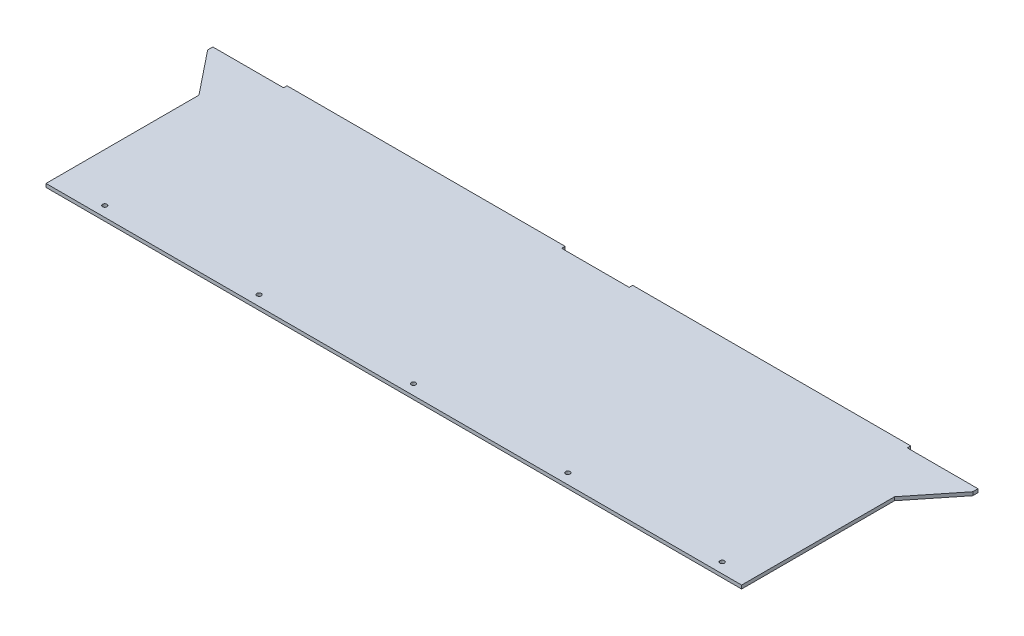
ISO-10303-21;
HEADER;
FILE_DESCRIPTION(('STEP AP214'),'2;1');
FILE_NAME('part.step','',(''),(''),'','','');
FILE_SCHEMA(('AUTOMOTIVE_DESIGN { 1 0 10303 214 1 1 1 1 }'));
ENDSEC;
DATA;
#1=APPLICATION_CONTEXT('core data for automotive mechanical design processes');
#2=APPLICATION_PROTOCOL_DEFINITION('international standard','automotive_design',2000,#1);
#3=PRODUCT_CONTEXT('',#1,'mechanical');
#4=PRODUCT('Part','Part','',(#3));
#5=PRODUCT_RELATED_PRODUCT_CATEGORY('part','',(#4));
#6=PRODUCT_DEFINITION_FORMATION('','',#4);
#7=PRODUCT_DEFINITION_CONTEXT('part definition',#1,'design');
#8=PRODUCT_DEFINITION('design','',#6,#7);
#9=PRODUCT_DEFINITION_SHAPE('','',#8);
#10=(LENGTH_UNIT() NAMED_UNIT(*) SI_UNIT(.MILLI.,.METRE.));
#11=(NAMED_UNIT(*) PLANE_ANGLE_UNIT() SI_UNIT($,.RADIAN.));
#12=(NAMED_UNIT(*) SI_UNIT($,.STERADIAN.) SOLID_ANGLE_UNIT());
#13=UNCERTAINTY_MEASURE_WITH_UNIT(LENGTH_MEASURE(1.E-05),#10,'distance_accuracy_value','');
#14=(GEOMETRIC_REPRESENTATION_CONTEXT(3) GLOBAL_UNCERTAINTY_ASSIGNED_CONTEXT((#13)) GLOBAL_UNIT_ASSIGNED_CONTEXT((#10,
#11,#12)) REPRESENTATION_CONTEXT('',''));
#15=CARTESIAN_POINT('',(0.,0.,0.));
#16=DIRECTION('',(0.,0.,1.));
#17=DIRECTION('',(1.,0.,0.));
#18=AXIS2_PLACEMENT_3D('',#15,#16,#17);
#19=CARTESIAN_POINT('',(-273.3802,-8.4125,82.677));
#20=DIRECTION('',(0.,1.,0.));
#21=DIRECTION('',(0.,0.,1.));
#22=AXIS2_PLACEMENT_3D('',#19,#20,#21);
#23=CYLINDRICAL_SURFACE('',#22,2.02500000000001);
#24=CARTESIAN_POINT('',(-273.3802,1.5875,82.677));
#25=DIRECTION('',(0.,1.,0.));
#26=DIRECTION('',(0.,0.,1.));
#27=AXIS2_PLACEMENT_3D('',#24,#25,#26);
#28=CIRCLE('',#27,2.02500000000001);
#29=CARTESIAN_POINT('',(-273.3802,1.5875,84.702));
#30=VERTEX_POINT('',#29);
#31=EDGE_CURVE('E43',#30,#30,#28,.T.);
#32=ORIENTED_EDGE('',*,*,#31,.T.);
#33=EDGE_LOOP('',(#32));
#34=FACE_BOUND('',#33,.T.);
#35=CARTESIAN_POINT('',(-273.3802,-1.5875,82.677));
#36=DIRECTION('',(0.,1.,0.));
#37=DIRECTION('',(0.,0.,1.));
#38=AXIS2_PLACEMENT_3D('',#35,#36,#37);
#39=CIRCLE('',#38,2.02500000000001);
#40=CARTESIAN_POINT('',(-273.3802,-1.5875,84.702));
#41=VERTEX_POINT('',#40);
#42=EDGE_CURVE('E11',#41,#41,#39,.T.);
#43=ORIENTED_EDGE('',*,*,#42,.F.);
#44=EDGE_LOOP('',(#43));
#45=FACE_BOUND('',#44,.T.);
#46=ADVANCED_FACE('F36',(#34,#45),#23,.F.);
#47=CARTESIAN_POINT('',(-132.4102,-8.4125,82.677));
#48=DIRECTION('',(0.,1.,0.));
#49=DIRECTION('',(0.,0.,1.));
#50=AXIS2_PLACEMENT_3D('',#47,#48,#49);
#51=CYLINDRICAL_SURFACE('',#50,2.02500000000001);
#52=CARTESIAN_POINT('',(-132.4102,1.5875,82.677));
#53=DIRECTION('',(0.,1.,0.));
#54=DIRECTION('',(0.,0.,1.));
#55=AXIS2_PLACEMENT_3D('',#52,#53,#54);
#56=CIRCLE('',#55,2.02500000000001);
#57=CARTESIAN_POINT('',(-132.4102,1.5875,84.702));
#58=VERTEX_POINT('',#57);
#59=EDGE_CURVE('E207',#58,#58,#56,.T.);
#60=ORIENTED_EDGE('',*,*,#59,.T.);
#61=EDGE_LOOP('',(#60));
#62=FACE_BOUND('',#61,.T.);
#63=CARTESIAN_POINT('',(-132.4102,-1.5875,82.677));
#64=DIRECTION('',(0.,1.,0.));
#65=DIRECTION('',(0.,0.,1.));
#66=AXIS2_PLACEMENT_3D('',#63,#64,#65);
#67=CIRCLE('',#66,2.02500000000001);
#68=CARTESIAN_POINT('',(-132.4102,-1.5875,84.702));
#69=VERTEX_POINT('',#68);
#70=EDGE_CURVE('E210',#69,#69,#67,.T.);
#71=ORIENTED_EDGE('',*,*,#70,.F.);
#72=EDGE_LOOP('',(#71));
#73=FACE_BOUND('',#72,.T.);
#74=ADVANCED_FACE('F235',(#62,#73),#51,.F.);
#75=CARTESIAN_POINT('',(8.55980000000006,-8.4125,82.677));
#76=DIRECTION('',(0.,1.,0.));
#77=DIRECTION('',(0.,0.,1.));
#78=AXIS2_PLACEMENT_3D('',#75,#76,#77);
#79=CYLINDRICAL_SURFACE('',#78,2.02500000000001);
#80=CARTESIAN_POINT('',(8.55980000000006,1.5875,82.677));
#81=DIRECTION('',(0.,1.,0.));
#82=DIRECTION('',(0.,0.,1.));
#83=AXIS2_PLACEMENT_3D('',#80,#81,#82);
#84=CIRCLE('',#83,2.02500000000001);
#85=CARTESIAN_POINT('',(8.55980000000006,1.5875,84.702));
#86=VERTEX_POINT('',#85);
#87=EDGE_CURVE('E197',#86,#86,#84,.T.);
#88=ORIENTED_EDGE('',*,*,#87,.T.);
#89=EDGE_LOOP('',(#88));
#90=FACE_BOUND('',#89,.T.);
#91=CARTESIAN_POINT('',(8.55980000000006,-1.5875,82.677));
#92=DIRECTION('',(0.,1.,0.));
#93=DIRECTION('',(0.,0.,1.));
#94=AXIS2_PLACEMENT_3D('',#91,#92,#93);
#95=CIRCLE('',#94,2.02500000000001);
#96=CARTESIAN_POINT('',(8.55980000000006,-1.5875,84.702));
#97=VERTEX_POINT('',#96);
#98=EDGE_CURVE('E204',#97,#97,#95,.T.);
#99=ORIENTED_EDGE('',*,*,#98,.F.);
#100=EDGE_LOOP('',(#99));
#101=FACE_BOUND('',#100,.T.);
#102=ADVANCED_FACE('F239',(#90,#101),#79,.F.);
#103=CARTESIAN_POINT('',(317.6778,1.5875,-92.075));
#104=DIRECTION('',(-1.,0.,0.));
#105=DIRECTION('',(0.,0.,1.));
#106=AXIS2_PLACEMENT_3D('',#103,#104,#105);
#107=PLANE('',#106);
#108=DIRECTION('',(0.,-1.,0.));
#109=VECTOR('',#108,1.);
#110=CARTESIAN_POINT('',(317.6778,1.5875,-47.625));
#111=LINE('',#110,#109);
#112=CARTESIAN_POINT('',(317.6778,1.5875,-47.625));
#113=VERTEX_POINT('',#112);
#114=CARTESIAN_POINT('',(317.6778,-1.5875,-47.625));
#115=VERTEX_POINT('',#114);
#116=EDGE_CURVE('E58',#113,#115,#111,.T.);
#117=ORIENTED_EDGE('',*,*,#116,.F.);
#118=DIRECTION('',(0.,0.,-1.));
#119=VECTOR('',#118,1.);
#120=CARTESIAN_POINT('',(317.6778,1.5875,-92.075));
#121=LINE('',#120,#119);
#122=CARTESIAN_POINT('',(317.6778,1.5875,92.075));
#123=VERTEX_POINT('',#122);
#124=EDGE_CURVE('E193',#123,#113,#121,.T.);
#125=ORIENTED_EDGE('',*,*,#124,.F.);
#126=DIRECTION('',(0.,-1.,0.));
#127=VECTOR('',#126,1.);
#128=CARTESIAN_POINT('',(317.6778,1.5875,92.075));
#129=LINE('',#128,#127);
#130=CARTESIAN_POINT('',(317.6778,-1.5875,92.075));
#131=VERTEX_POINT('',#130);
#132=EDGE_CURVE('E174',#123,#131,#129,.T.);
#133=ORIENTED_EDGE('',*,*,#132,.T.);
#134=DIRECTION('',(0.,0.,-1.));
#135=VECTOR('',#134,1.);
#136=CARTESIAN_POINT('',(317.6778,-1.5875,-92.075));
#137=LINE('',#136,#135);
#138=EDGE_CURVE('E182',#131,#115,#137,.T.);
#139=ORIENTED_EDGE('',*,*,#138,.T.);
#140=EDGE_LOOP('',(#117,#125,#133,#139));
#141=FACE_BOUND('',#140,.T.);
#142=ADVANCED_FACE('F244',(#141),#107,.F.);
#143=CARTESIAN_POINT('',(-317.6778,1.5875,-92.075));
#144=DIRECTION('',(0.,0.,1.));
#145=DIRECTION('',(1.,0.,0.));
#146=AXIS2_PLACEMENT_3D('',#143,#144,#145);
#147=PLANE('',#146);
#148=DIRECTION('',(0.,-1.,0.));
#149=VECTOR('',#148,1.);
#150=CARTESIAN_POINT('',(284.822900000001,-1.58750000000007,-92.075));
#151=LINE('',#150,#149);
#152=CARTESIAN_POINT('',(284.822900000002,1.5875,-92.075));
#153=VERTEX_POINT('',#152);
#154=CARTESIAN_POINT('',(284.822900000002,-1.5875,-92.075));
#155=VERTEX_POINT('',#154);
#156=EDGE_CURVE('E333',#153,#155,#151,.T.);
#157=ORIENTED_EDGE('',*,*,#156,.F.);
#158=DIRECTION('',(-1.,0.,0.));
#159=VECTOR('',#158,1.);
#160=CARTESIAN_POINT('',(-317.6778,1.5875,-92.075));
#161=LINE('',#160,#159);
#162=CARTESIAN_POINT('',(349.4278,1.5875,-92.075));
#163=VERTEX_POINT('',#162);
#164=EDGE_CURVE('E172',#163,#153,#161,.T.);
#165=ORIENTED_EDGE('',*,*,#164,.F.);
#166=DIRECTION('',(0.,-1.,0.));
#167=VECTOR('',#166,1.);
#168=CARTESIAN_POINT('',(349.4278,1.5875,-92.075));
#169=LINE('',#168,#167);
#170=CARTESIAN_POINT('',(349.4278,-1.5875,-92.075));
#171=VERTEX_POINT('',#170);
#172=EDGE_CURVE('E343',#163,#171,#169,.T.);
#173=ORIENTED_EDGE('',*,*,#172,.T.);
#174=DIRECTION('',(-1.,0.,0.));
#175=VECTOR('',#174,1.);
#176=CARTESIAN_POINT('',(-317.6778,-1.5875,-92.075));
#177=LINE('',#176,#175);
#178=EDGE_CURVE('E186',#171,#155,#177,.T.);
#179=ORIENTED_EDGE('',*,*,#178,.T.);
#180=EDGE_LOOP('',(#157,#165,#173,#179));
#181=FACE_BOUND('',#180,.T.);
#182=ADVANCED_FACE('F251',(#181),#147,.F.);
#183=DIRECTION('',(0.,1.,0.));
#184=VECTOR('',#183,1.);
#185=CARTESIAN_POINT('',(30.8229000000015,1.58749999999994,-92.075));
#186=LINE('',#185,#184);
#187=CARTESIAN_POINT('',(30.8229000000015,-1.58750000000007,-92.075));
#188=VERTEX_POINT('',#187);
#189=CARTESIAN_POINT('',(30.8229000000014,1.5875,-92.075));
#190=VERTEX_POINT('',#189);
#191=EDGE_CURVE('E330',#188,#190,#186,.T.);
#192=ORIENTED_EDGE('',*,*,#191,.F.);
#193=CARTESIAN_POINT('',(-30.8229000000015,-1.5875,-92.075));
#194=VERTEX_POINT('',#193);
#195=EDGE_CURVE('E189',#188,#194,#177,.T.);
#196=ORIENTED_EDGE('',*,*,#195,.T.);
#197=DIRECTION('',(0.,-1.,0.));
#198=VECTOR('',#197,1.);
#199=CARTESIAN_POINT('',(-30.8229000000015,-1.58750000000007,-92.075));
#200=LINE('',#199,#198);
#201=CARTESIAN_POINT('',(-30.8229000000015,1.5875,-92.075));
#202=VERTEX_POINT('',#201);
#203=EDGE_CURVE('E276',#202,#194,#200,.T.);
#204=ORIENTED_EDGE('',*,*,#203,.F.);
#205=EDGE_CURVE('E177',#190,#202,#161,.T.);
#206=ORIENTED_EDGE('',*,*,#205,.F.);
#207=EDGE_LOOP('',(#192,#196,#204,#206));
#208=FACE_BOUND('',#207,.T.);
#209=ADVANCED_FACE('F254',(#208),#147,.F.);
#210=DIRECTION('',(0.,1.,0.));
#211=VECTOR('',#210,1.);
#212=CARTESIAN_POINT('',(-284.822900000001,1.58749999999994,-92.075));
#213=LINE('',#212,#211);
#214=CARTESIAN_POINT('',(-284.822900000001,-1.5875,-92.075));
#215=VERTEX_POINT('',#214);
#216=CARTESIAN_POINT('',(-284.822900000001,1.58749999999994,-92.075));
#217=VERTEX_POINT('',#216);
#218=EDGE_CURVE('E267',#215,#217,#213,.T.);
#219=ORIENTED_EDGE('',*,*,#218,.F.);
#220=CARTESIAN_POINT('',(-349.4278,-1.5875,-92.075));
#221=VERTEX_POINT('',#220);
#222=EDGE_CURVE('E184',#215,#221,#177,.T.);
#223=ORIENTED_EDGE('',*,*,#222,.T.);
#224=DIRECTION('',(0.,-1.,0.));
#225=VECTOR('',#224,1.);
#226=CARTESIAN_POINT('',(-349.4278,1.5875,-92.075));
#227=LINE('',#226,#225);
#228=CARTESIAN_POINT('',(-349.4278,1.5875,-92.075));
#229=VERTEX_POINT('',#228);
#230=EDGE_CURVE('E357',#229,#221,#227,.T.);
#231=ORIENTED_EDGE('',*,*,#230,.F.);
#232=EDGE_CURVE('E179',#217,#229,#161,.T.);
#233=ORIENTED_EDGE('',*,*,#232,.F.);
#234=EDGE_LOOP('',(#219,#223,#231,#233));
#235=FACE_BOUND('',#234,.T.);
#236=ADVANCED_FACE('F256',(#235),#147,.F.);
#237=CARTESIAN_POINT('',(-317.6778,1.5875,-92.075));
#238=DIRECTION('',(1.,0.,0.));
#239=DIRECTION('',(0.,0.,-1.));
#240=AXIS2_PLACEMENT_3D('',#237,#238,#239);
#241=PLANE('',#240);
#242=DIRECTION('',(0.,0.,1.));
#243=VECTOR('',#242,1.);
#244=CARTESIAN_POINT('',(-317.6778,1.5875,-92.075));
#245=LINE('',#244,#243);
#246=CARTESIAN_POINT('',(-317.6778,1.5875,-47.625));
#247=VERTEX_POINT('',#246);
#248=CARTESIAN_POINT('',(-317.6778,1.5875,92.075));
#249=VERTEX_POINT('',#248);
#250=EDGE_CURVE('E154',#247,#249,#245,.T.);
#251=ORIENTED_EDGE('',*,*,#250,.F.);
#252=DIRECTION('',(0.,-1.,0.));
#253=VECTOR('',#252,1.);
#254=CARTESIAN_POINT('',(-317.6778,1.5875,-47.625));
#255=LINE('',#254,#253);
#256=CARTESIAN_POINT('',(-317.6778,-1.5875,-47.625));
#257=VERTEX_POINT('',#256);
#258=EDGE_CURVE('E161',#247,#257,#255,.T.);
#259=ORIENTED_EDGE('',*,*,#258,.T.);
#260=DIRECTION('',(0.,0.,1.));
#261=VECTOR('',#260,1.);
#262=CARTESIAN_POINT('',(-317.6778,-1.5875,-92.075));
#263=LINE('',#262,#261);
#264=CARTESIAN_POINT('',(-317.6778,-1.5875,92.075));
#265=VERTEX_POINT('',#264);
#266=EDGE_CURVE('E188',#257,#265,#263,.T.);
#267=ORIENTED_EDGE('',*,*,#266,.T.);
#268=DIRECTION('',(0.,-1.,0.));
#269=VECTOR('',#268,1.);
#270=CARTESIAN_POINT('',(-317.6778,1.5875,92.075));
#271=LINE('',#270,#269);
#272=EDGE_CURVE('E169',#249,#265,#271,.T.);
#273=ORIENTED_EDGE('',*,*,#272,.F.);
#274=EDGE_LOOP('',(#251,#259,#267,#273));
#275=FACE_BOUND('',#274,.T.);
#276=ADVANCED_FACE('F167',(#275),#241,.F.);
#277=CARTESIAN_POINT('',(-317.6778,1.5875,92.075));
#278=DIRECTION('',(0.,0.,-1.));
#279=DIRECTION('',(-1.,0.,0.));
#280=AXIS2_PLACEMENT_3D('',#277,#278,#279);
#281=PLANE('',#280);
#282=DIRECTION('',(1.,0.,0.));
#283=VECTOR('',#282,1.);
#284=CARTESIAN_POINT('',(-317.6778,-1.5875,92.075));
#285=LINE('',#284,#283);
#286=EDGE_CURVE('E191',#265,#131,#285,.T.);
#287=ORIENTED_EDGE('',*,*,#286,.T.);
#288=ORIENTED_EDGE('',*,*,#132,.F.);
#289=DIRECTION('',(1.,0.,0.));
#290=VECTOR('',#289,1.);
#291=CARTESIAN_POINT('',(-317.6778,1.5875,92.075));
#292=LINE('',#291,#290);
#293=EDGE_CURVE('E171',#249,#123,#292,.T.);
#294=ORIENTED_EDGE('',*,*,#293,.F.);
#295=ORIENTED_EDGE('',*,*,#272,.T.);
#296=EDGE_LOOP('',(#287,#288,#294,#295));
#297=FACE_BOUND('',#296,.T.);
#298=ADVANCED_FACE('F219',(#297),#281,.F.);
#299=CARTESIAN_POINT('',(0.,1.5875,0.));
#300=DIRECTION('',(0.,1.,0.));
#301=DIRECTION('',(0.,0.,1.));
#302=AXIS2_PLACEMENT_3D('',#299,#300,#301);
#303=PLANE('',#302);
#304=CARTESIAN_POINT('',(149.5298,1.5875,82.677));
#305=DIRECTION('',(0.,1.,0.));
#306=DIRECTION('',(0.,0.,1.));
#307=AXIS2_PLACEMENT_3D('',#304,#305,#306);
#308=CIRCLE('',#307,2.02500000000001);
#309=CARTESIAN_POINT('',(149.5298,1.5875,84.702));
#310=VERTEX_POINT('',#309);
#311=EDGE_CURVE('E371',#310,#310,#308,.T.);
#312=ORIENTED_EDGE('',*,*,#311,.F.);
#313=EDGE_LOOP('',(#312));
#314=FACE_BOUND('',#313,.T.);
#315=CARTESIAN_POINT('',(290.4998,1.5875,82.677));
#316=DIRECTION('',(0.,1.,0.));
#317=DIRECTION('',(0.,0.,1.));
#318=AXIS2_PLACEMENT_3D('',#315,#316,#317);
#319=CIRCLE('',#318,2.02500000000001);
#320=CARTESIAN_POINT('',(290.4998,1.5875,84.702));
#321=VERTEX_POINT('',#320);
#322=EDGE_CURVE('E201',#321,#321,#319,.T.);
#323=ORIENTED_EDGE('',*,*,#322,.F.);
#324=EDGE_LOOP('',(#323));
#325=FACE_BOUND('',#324,.T.);
#326=ORIENTED_EDGE('',*,*,#124,.T.);
#327=DIRECTION('',(-0.624695047554456,0.,0.780868809443005));
#328=VECTOR('',#327,1.);
#329=CARTESIAN_POINT('',(349.427800000003,1.5875,-87.3125));
#330=LINE('',#329,#328);
#331=CARTESIAN_POINT('',(349.427800000003,1.5875,-87.3125));
#332=VERTEX_POINT('',#331);
#333=EDGE_CURVE('E347',#332,#113,#330,.T.);
#334=ORIENTED_EDGE('',*,*,#333,.F.);
#335=DIRECTION('',(5.47826584329473E-13,0.,1.));
#336=VECTOR('',#335,1.);
#337=CARTESIAN_POINT('',(349.4278,1.5875,-92.075));
#338=LINE('',#337,#336);
#339=EDGE_CURVE('E353',#163,#332,#338,.T.);
#340=ORIENTED_EDGE('',*,*,#339,.F.);
#341=ORIENTED_EDGE('',*,*,#164,.T.);
#342=DIRECTION('',(0.,0.,1.));
#343=VECTOR('',#342,1.);
#344=CARTESIAN_POINT('',(284.822900000001,1.58749999999994,-95.25));
#345=LINE('',#344,#343);
#346=CARTESIAN_POINT('',(284.822900000001,1.58749999999994,-95.25));
#347=VERTEX_POINT('',#346);
#348=EDGE_CURVE('E326',#347,#153,#345,.T.);
#349=ORIENTED_EDGE('',*,*,#348,.F.);
#350=DIRECTION('',(1.,0.,0.));
#351=VECTOR('',#350,1.);
#352=CARTESIAN_POINT('',(284.822900000001,1.58749999999994,-95.25));
#353=LINE('',#352,#351);
#354=CARTESIAN_POINT('',(30.8229000000015,1.58749999999994,-95.25));
#355=VERTEX_POINT('',#354);
#356=EDGE_CURVE('E329',#355,#347,#353,.T.);
#357=ORIENTED_EDGE('',*,*,#356,.F.);
#358=DIRECTION('',(0.,0.,1.));
#359=VECTOR('',#358,1.);
#360=CARTESIAN_POINT('',(30.8229000000015,1.58749999999994,-95.25));
#361=LINE('',#360,#359);
#362=EDGE_CURVE('E304',#355,#190,#361,.T.);
#363=ORIENTED_EDGE('',*,*,#362,.T.);
#364=ORIENTED_EDGE('',*,*,#205,.T.);
#365=DIRECTION('',(0.,0.,1.));
#366=VECTOR('',#365,1.);
#367=CARTESIAN_POINT('',(-30.8229000000015,1.58749999999994,-95.25));
#368=LINE('',#367,#366);
#369=CARTESIAN_POINT('',(-30.8229000000015,1.58749999999994,-95.25));
#370=VERTEX_POINT('',#369);
#371=EDGE_CURVE('E291',#370,#202,#368,.T.);
#372=ORIENTED_EDGE('',*,*,#371,.F.);
#373=DIRECTION('',(1.,0.,0.));
#374=VECTOR('',#373,1.);
#375=CARTESIAN_POINT('',(-30.8229000000015,1.58749999999994,-95.25));
#376=LINE('',#375,#374);
#377=CARTESIAN_POINT('',(-284.822900000001,1.58749999999994,-95.25));
#378=VERTEX_POINT('',#377);
#379=EDGE_CURVE('E313',#378,#370,#376,.T.);
#380=ORIENTED_EDGE('',*,*,#379,.F.);
#381=DIRECTION('',(0.,0.,1.));
#382=VECTOR('',#381,1.);
#383=CARTESIAN_POINT('',(-284.822900000001,1.58749999999994,-95.25));
#384=LINE('',#383,#382);
#385=EDGE_CURVE('E287',#378,#217,#384,.T.);
#386=ORIENTED_EDGE('',*,*,#385,.T.);
#387=ORIENTED_EDGE('',*,*,#232,.T.);
#388=DIRECTION('',(-5.47826584329473E-13,0.,1.));
#389=VECTOR('',#388,1.);
#390=CARTESIAN_POINT('',(-349.4278,1.5875,-92.075));
#391=LINE('',#390,#389);
#392=CARTESIAN_POINT('',(-349.427800000003,1.5875,-87.3125));
#393=VERTEX_POINT('',#392);
#394=EDGE_CURVE('E157',#229,#393,#391,.T.);
#395=ORIENTED_EDGE('',*,*,#394,.T.);
#396=DIRECTION('',(0.624695047554456,0.,0.780868809443005));
#397=VECTOR('',#396,1.);
#398=CARTESIAN_POINT('',(-349.427800000003,1.5875,-87.3125));
#399=LINE('',#398,#397);
#400=EDGE_CURVE('E150',#393,#247,#399,.T.);
#401=ORIENTED_EDGE('',*,*,#400,.T.);
#402=ORIENTED_EDGE('',*,*,#250,.T.);
#403=ORIENTED_EDGE('',*,*,#293,.T.);
#404=EDGE_LOOP('',(#326,#334,#340,#341,#349,#357,#363,#364,#372,#380,#386,#387,#395,#401,#402,#403));
#405=FACE_BOUND('',#404,.T.);
#406=ORIENTED_EDGE('',*,*,#87,.F.);
#407=EDGE_LOOP('',(#406));
#408=FACE_BOUND('',#407,.T.);
#409=ORIENTED_EDGE('',*,*,#59,.F.);
#410=EDGE_LOOP('',(#409));
#411=FACE_BOUND('',#410,.T.);
#412=ORIENTED_EDGE('',*,*,#31,.F.);
#413=EDGE_LOOP('',(#412));
#414=FACE_BOUND('',#413,.T.);
#415=ADVANCED_FACE('F151',(#314,#325,#405,#408,#411,#414),#303,.T.);
#416=CARTESIAN_POINT('',(0.,-1.5875,0.));
#417=DIRECTION('',(0.,1.,0.));
#418=DIRECTION('',(0.,0.,1.));
#419=AXIS2_PLACEMENT_3D('',#416,#417,#418);
#420=PLANE('',#419);
#421=CARTESIAN_POINT('',(149.5298,-1.5875,82.677));
#422=DIRECTION('',(0.,1.,0.));
#423=DIRECTION('',(0.,0.,1.));
#424=AXIS2_PLACEMENT_3D('',#421,#422,#423);
#425=CIRCLE('',#424,2.02500000000001);
#426=CARTESIAN_POINT('',(149.5298,-1.5875,84.702));
#427=VERTEX_POINT('',#426);
#428=EDGE_CURVE('E368',#427,#427,#425,.T.);
#429=ORIENTED_EDGE('',*,*,#428,.T.);
#430=EDGE_LOOP('',(#429));
#431=FACE_BOUND('',#430,.T.);
#432=CARTESIAN_POINT('',(290.4998,-1.5875,82.677));
#433=DIRECTION('',(0.,1.,0.));
#434=DIRECTION('',(0.,0.,1.));
#435=AXIS2_PLACEMENT_3D('',#432,#433,#434);
#436=CIRCLE('',#435,2.02500000000001);
#437=CARTESIAN_POINT('',(290.4998,-1.5875,84.702));
#438=VERTEX_POINT('',#437);
#439=EDGE_CURVE('E198',#438,#438,#436,.T.);
#440=ORIENTED_EDGE('',*,*,#439,.T.);
#441=EDGE_LOOP('',(#440));
#442=FACE_BOUND('',#441,.T.);
#443=ORIENTED_EDGE('',*,*,#138,.F.);
#444=ORIENTED_EDGE('',*,*,#286,.F.);
#445=ORIENTED_EDGE('',*,*,#266,.F.);
#446=DIRECTION('',(0.624695047554456,0.,0.780868809443005));
#447=VECTOR('',#446,1.);
#448=CARTESIAN_POINT('',(-349.427800000003,-1.5875,-87.3125));
#449=LINE('',#448,#447);
#450=CARTESIAN_POINT('',(-349.427800000003,-1.5875,-87.3125));
#451=VERTEX_POINT('',#450);
#452=EDGE_CURVE('E50',#451,#257,#449,.T.);
#453=ORIENTED_EDGE('',*,*,#452,.F.);
#454=DIRECTION('',(-5.47826584329473E-13,0.,1.));
#455=VECTOR('',#454,1.);
#456=CARTESIAN_POINT('',(-349.4278,-1.5875,-92.075));
#457=LINE('',#456,#455);
#458=EDGE_CURVE('E159',#221,#451,#457,.T.);
#459=ORIENTED_EDGE('',*,*,#458,.F.);
#460=ORIENTED_EDGE('',*,*,#222,.F.);
#461=DIRECTION('',(0.,0.,1.));
#462=VECTOR('',#461,1.);
#463=CARTESIAN_POINT('',(-284.822900000001,-1.58750000000007,-95.25));
#464=LINE('',#463,#462);
#465=CARTESIAN_POINT('',(-284.822900000001,-1.58750000000007,-95.25));
#466=VERTEX_POINT('',#465);
#467=EDGE_CURVE('E283',#466,#215,#464,.T.);
#468=ORIENTED_EDGE('',*,*,#467,.F.);
#469=DIRECTION('',(-1.,0.,0.));
#470=VECTOR('',#469,1.);
#471=CARTESIAN_POINT('',(-30.8229000000015,-1.58750000000007,-95.25));
#472=LINE('',#471,#470);
#473=CARTESIAN_POINT('',(-30.8229000000015,-1.58750000000007,-95.25));
#474=VERTEX_POINT('',#473);
#475=EDGE_CURVE('E317',#474,#466,#472,.T.);
#476=ORIENTED_EDGE('',*,*,#475,.F.);
#477=DIRECTION('',(0.,0.,1.));
#478=VECTOR('',#477,1.);
#479=CARTESIAN_POINT('',(-30.8229000000015,-1.58750000000007,-95.25));
#480=LINE('',#479,#478);
#481=EDGE_CURVE('E185',#474,#194,#480,.T.);
#482=ORIENTED_EDGE('',*,*,#481,.T.);
#483=ORIENTED_EDGE('',*,*,#195,.F.);
#484=DIRECTION('',(0.,0.,1.));
#485=VECTOR('',#484,1.);
#486=CARTESIAN_POINT('',(30.8229000000015,-1.58750000000007,-95.25));
#487=LINE('',#486,#485);
#488=CARTESIAN_POINT('',(30.8229000000015,-1.58750000000007,-95.25));
#489=VERTEX_POINT('',#488);
#490=EDGE_CURVE('E322',#489,#188,#487,.T.);
#491=ORIENTED_EDGE('',*,*,#490,.F.);
#492=DIRECTION('',(-1.,0.,0.));
#493=VECTOR('',#492,1.);
#494=CARTESIAN_POINT('',(284.822900000001,-1.58750000000007,-95.25));
#495=LINE('',#494,#493);
#496=CARTESIAN_POINT('',(284.822900000001,-1.58750000000007,-95.25));
#497=VERTEX_POINT('',#496);
#498=EDGE_CURVE('E339',#497,#489,#495,.T.);
#499=ORIENTED_EDGE('',*,*,#498,.F.);
#500=DIRECTION('',(0.,0.,1.));
#501=VECTOR('',#500,1.);
#502=CARTESIAN_POINT('',(284.822900000001,-1.58750000000007,-95.25));
#503=LINE('',#502,#501);
#504=EDGE_CURVE('E310',#497,#155,#503,.T.);
#505=ORIENTED_EDGE('',*,*,#504,.T.);
#506=ORIENTED_EDGE('',*,*,#178,.F.);
#507=DIRECTION('',(5.47826584329473E-13,0.,1.));
#508=VECTOR('',#507,1.);
#509=CARTESIAN_POINT('',(349.4278,-1.5875,-92.075));
#510=LINE('',#509,#508);
#511=CARTESIAN_POINT('',(349.427800000003,-1.5875,-87.3125));
#512=VERTEX_POINT('',#511);
#513=EDGE_CURVE('E354',#171,#512,#510,.T.);
#514=ORIENTED_EDGE('',*,*,#513,.T.);
#515=DIRECTION('',(-0.624695047554456,0.,0.780868809443005));
#516=VECTOR('',#515,1.);
#517=CARTESIAN_POINT('',(349.427800000003,-1.5875,-87.3125));
#518=LINE('',#517,#516);
#519=EDGE_CURVE('E350',#512,#115,#518,.T.);
#520=ORIENTED_EDGE('',*,*,#519,.T.);
#521=EDGE_LOOP('',(#443,#444,#445,#453,#459,#460,#468,#476,#482,#483,#491,#499,#505,#506,#514,#520));
#522=FACE_BOUND('',#521,.T.);
#523=ORIENTED_EDGE('',*,*,#98,.T.);
#524=EDGE_LOOP('',(#523));
#525=FACE_BOUND('',#524,.T.);
#526=ORIENTED_EDGE('',*,*,#70,.T.);
#527=EDGE_LOOP('',(#526));
#528=FACE_BOUND('',#527,.T.);
#529=ORIENTED_EDGE('',*,*,#42,.T.);
#530=EDGE_LOOP('',(#529));
#531=FACE_BOUND('',#530,.T.);
#532=ADVANCED_FACE('F218',(#431,#442,#522,#525,#528,#531),#420,.F.);
#533=CARTESIAN_POINT('',(-30.8229000000015,-1.58750000000007,-95.25));
#534=DIRECTION('',(-1.,0.,0.));
#535=DIRECTION('',(0.,0.,1.));
#536=AXIS2_PLACEMENT_3D('',#533,#534,#535);
#537=PLANE('',#536);
#538=ORIENTED_EDGE('',*,*,#203,.T.);
#539=ORIENTED_EDGE('',*,*,#481,.F.);
#540=DIRECTION('',(0.,-1.,0.));
#541=VECTOR('',#540,1.);
#542=CARTESIAN_POINT('',(-30.8229000000015,-1.58750000000007,-95.25));
#543=LINE('',#542,#541);
#544=EDGE_CURVE('E275',#370,#474,#543,.T.);
#545=ORIENTED_EDGE('',*,*,#544,.F.);
#546=ORIENTED_EDGE('',*,*,#371,.T.);
#547=EDGE_LOOP('',(#538,#539,#545,#546));
#548=FACE_BOUND('',#547,.T.);
#549=ADVANCED_FACE('F226',(#548),#537,.F.);
#550=CARTESIAN_POINT('',(-284.822900000001,1.58749999999994,-95.25));
#551=DIRECTION('',(1.,0.,0.));
#552=DIRECTION('',(0.,1.,0.));
#553=AXIS2_PLACEMENT_3D('',#550,#551,#552);
#554=PLANE('',#553);
#555=ORIENTED_EDGE('',*,*,#218,.T.);
#556=ORIENTED_EDGE('',*,*,#385,.F.);
#557=DIRECTION('',(0.,1.,0.));
#558=VECTOR('',#557,1.);
#559=CARTESIAN_POINT('',(-284.822900000001,1.58749999999994,-95.25));
#560=LINE('',#559,#558);
#561=EDGE_CURVE('E286',#466,#378,#560,.T.);
#562=ORIENTED_EDGE('',*,*,#561,.F.);
#563=ORIENTED_EDGE('',*,*,#467,.T.);
#564=EDGE_LOOP('',(#555,#556,#562,#563));
#565=FACE_BOUND('',#564,.T.);
#566=ADVANCED_FACE('F285',(#565),#554,.F.);
#567=CARTESIAN_POINT('',(0.,0.,-95.25));
#568=DIRECTION('',(0.,0.,1.));
#569=DIRECTION('',(1.,0.,0.));
#570=AXIS2_PLACEMENT_3D('',#567,#568,#569);
#571=PLANE('',#570);
#572=ORIENTED_EDGE('',*,*,#544,.T.);
#573=ORIENTED_EDGE('',*,*,#475,.T.);
#574=ORIENTED_EDGE('',*,*,#561,.T.);
#575=ORIENTED_EDGE('',*,*,#379,.T.);
#576=EDGE_LOOP('',(#572,#573,#574,#575));
#577=FACE_BOUND('',#576,.T.);
#578=ADVANCED_FACE('F414',(#577),#571,.F.);
#579=CARTESIAN_POINT('',(284.822900000001,-1.58750000000007,-95.25));
#580=DIRECTION('',(-1.,0.,0.));
#581=DIRECTION('',(0.,-1.,0.));
#582=AXIS2_PLACEMENT_3D('',#579,#580,#581);
#583=PLANE('',#582);
#584=ORIENTED_EDGE('',*,*,#156,.T.);
#585=ORIENTED_EDGE('',*,*,#504,.F.);
#586=DIRECTION('',(0.,-1.,0.));
#587=VECTOR('',#586,1.);
#588=CARTESIAN_POINT('',(284.822900000001,-1.58750000000007,-95.25));
#589=LINE('',#588,#587);
#590=EDGE_CURVE('E332',#347,#497,#589,.T.);
#591=ORIENTED_EDGE('',*,*,#590,.F.);
#592=ORIENTED_EDGE('',*,*,#348,.T.);
#593=EDGE_LOOP('',(#584,#585,#591,#592));
#594=FACE_BOUND('',#593,.T.);
#595=ADVANCED_FACE('F410',(#594),#583,.F.);
#596=CARTESIAN_POINT('',(30.8229000000015,1.58749999999994,-95.25));
#597=DIRECTION('',(1.,0.,0.));
#598=DIRECTION('',(0.,0.,-1.));
#599=AXIS2_PLACEMENT_3D('',#596,#597,#598);
#600=PLANE('',#599);
#601=ORIENTED_EDGE('',*,*,#191,.T.);
#602=ORIENTED_EDGE('',*,*,#362,.F.);
#603=DIRECTION('',(0.,1.,0.));
#604=VECTOR('',#603,1.);
#605=CARTESIAN_POINT('',(30.8229000000015,1.58749999999994,-95.25));
#606=LINE('',#605,#604);
#607=EDGE_CURVE('E337',#489,#355,#606,.T.);
#608=ORIENTED_EDGE('',*,*,#607,.F.);
#609=ORIENTED_EDGE('',*,*,#490,.T.);
#610=EDGE_LOOP('',(#601,#602,#608,#609));
#611=FACE_BOUND('',#610,.T.);
#612=ADVANCED_FACE('F406',(#611),#600,.F.);
#613=CARTESIAN_POINT('',(0.,0.,-95.25));
#614=DIRECTION('',(0.,0.,1.));
#615=DIRECTION('',(1.,0.,0.));
#616=AXIS2_PLACEMENT_3D('',#613,#614,#615);
#617=PLANE('',#616);
#618=ORIENTED_EDGE('',*,*,#590,.T.);
#619=ORIENTED_EDGE('',*,*,#498,.T.);
#620=ORIENTED_EDGE('',*,*,#607,.T.);
#621=ORIENTED_EDGE('',*,*,#356,.T.);
#622=EDGE_LOOP('',(#618,#619,#620,#621));
#623=FACE_BOUND('',#622,.T.);
#624=ADVANCED_FACE('F399',(#623),#617,.F.);
#625=CARTESIAN_POINT('',(349.427800000003,1.5875,-87.3125));
#626=DIRECTION('',(0.780868809443005,0.,0.624695047554456));
#627=DIRECTION('',(0.624695047554456,0.,-0.780868809443005));
#628=AXIS2_PLACEMENT_3D('',#625,#626,#627);
#629=PLANE('',#628);
#630=ORIENTED_EDGE('',*,*,#519,.F.);
#631=DIRECTION('',(0.,-1.,0.));
#632=VECTOR('',#631,1.);
#633=CARTESIAN_POINT('',(349.427800000003,1.5875,-87.3125));
#634=LINE('',#633,#632);
#635=EDGE_CURVE('E346',#332,#512,#634,.T.);
#636=ORIENTED_EDGE('',*,*,#635,.F.);
#637=ORIENTED_EDGE('',*,*,#333,.T.);
#638=ORIENTED_EDGE('',*,*,#116,.T.);
#639=EDGE_LOOP('',(#630,#636,#637,#638));
#640=FACE_BOUND('',#639,.T.);
#641=ADVANCED_FACE('F396',(#640),#629,.T.);
#642=CARTESIAN_POINT('',(349.4278,1.5875,-92.075));
#643=DIRECTION('',(1.,0.,-5.47826584329473E-13));
#644=DIRECTION('',(-5.47826584329473E-13,0.,-1.));
#645=AXIS2_PLACEMENT_3D('',#642,#643,#644);
#646=PLANE('',#645);
#647=ORIENTED_EDGE('',*,*,#513,.F.);
#648=ORIENTED_EDGE('',*,*,#172,.F.);
#649=ORIENTED_EDGE('',*,*,#339,.T.);
#650=ORIENTED_EDGE('',*,*,#635,.T.);
#651=EDGE_LOOP('',(#647,#648,#649,#650));
#652=FACE_BOUND('',#651,.T.);
#653=ADVANCED_FACE('F393',(#652),#646,.T.);
#654=CARTESIAN_POINT('',(-349.4278,1.5875,-92.075));
#655=DIRECTION('',(1.,0.,5.47826584329473E-13));
#656=DIRECTION('',(5.47826584329473E-13,0.,-1.));
#657=AXIS2_PLACEMENT_3D('',#654,#655,#656);
#658=PLANE('',#657);
#659=ORIENTED_EDGE('',*,*,#458,.T.);
#660=DIRECTION('',(0.,-1.,0.));
#661=VECTOR('',#660,1.);
#662=CARTESIAN_POINT('',(-349.427800000003,1.5875,-87.3125));
#663=LINE('',#662,#661);
#664=EDGE_CURVE('E165',#393,#451,#663,.T.);
#665=ORIENTED_EDGE('',*,*,#664,.F.);
#666=ORIENTED_EDGE('',*,*,#394,.F.);
#667=ORIENTED_EDGE('',*,*,#230,.T.);
#668=EDGE_LOOP('',(#659,#665,#666,#667));
#669=FACE_BOUND('',#668,.T.);
#670=ADVANCED_FACE('F389',(#669),#658,.F.);
#671=CARTESIAN_POINT('',(-349.427800000003,1.5875,-87.3125));
#672=DIRECTION('',(0.780868809443005,0.,-0.624695047554456));
#673=DIRECTION('',(-0.624695047554456,0.,-0.780868809443005));
#674=AXIS2_PLACEMENT_3D('',#671,#672,#673);
#675=PLANE('',#674);
#676=ORIENTED_EDGE('',*,*,#452,.T.);
#677=ORIENTED_EDGE('',*,*,#258,.F.);
#678=ORIENTED_EDGE('',*,*,#400,.F.);
#679=ORIENTED_EDGE('',*,*,#664,.T.);
#680=EDGE_LOOP('',(#676,#677,#678,#679));
#681=FACE_BOUND('',#680,.T.);
#682=ADVANCED_FACE('F162',(#681),#675,.F.);
#683=CARTESIAN_POINT('',(290.4998,-8.4125,82.677));
#684=DIRECTION('',(0.,1.,0.));
#685=DIRECTION('',(0.,0.,1.));
#686=AXIS2_PLACEMENT_3D('',#683,#684,#685);
#687=CYLINDRICAL_SURFACE('',#686,2.02500000000001);
#688=ORIENTED_EDGE('',*,*,#322,.T.);
#689=EDGE_LOOP('',(#688));
#690=FACE_BOUND('',#689,.T.);
#691=ORIENTED_EDGE('',*,*,#439,.F.);
#692=EDGE_LOOP('',(#691));
#693=FACE_BOUND('',#692,.T.);
#694=ADVANCED_FACE('F377',(#690,#693),#687,.F.);
#695=CARTESIAN_POINT('',(149.5298,-8.4125,82.677));
#696=DIRECTION('',(0.,1.,0.));
#697=DIRECTION('',(0.,0.,1.));
#698=AXIS2_PLACEMENT_3D('',#695,#696,#697);
#699=CYLINDRICAL_SURFACE('',#698,2.02500000000001);
#700=ORIENTED_EDGE('',*,*,#311,.T.);
#701=EDGE_LOOP('',(#700));
#702=FACE_BOUND('',#701,.T.);
#703=ORIENTED_EDGE('',*,*,#428,.F.);
#704=EDGE_LOOP('',(#703));
#705=FACE_BOUND('',#704,.T.);
#706=ADVANCED_FACE('F374',(#702,#705),#699,.F.);
#707=CLOSED_SHELL('',(#46,#74,#102,#142,#182,#209,#236,#276,#298,#415,#532,#549,#566,#578,#595,
#612,#624,#641,#653,#670,#682,#694,#706));
#708=MANIFOLD_SOLID_BREP('B2',#707);
#709=ADVANCED_BREP_SHAPE_REPRESENTATION('',(#18,#708),#14);
#710=SHAPE_DEFINITION_REPRESENTATION(#9,#709);
ENDSEC;
END-ISO-10303-21;
